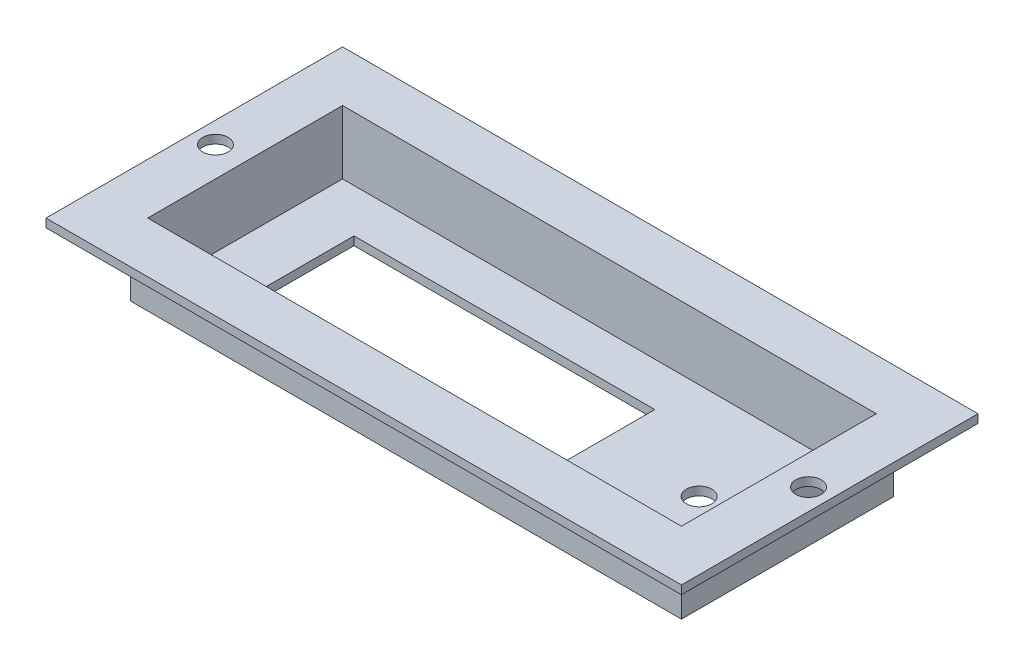
ISO-10303-21;
HEADER;
FILE_DESCRIPTION(('STEP AP214'),'2;1');
FILE_NAME('part.step','',(''),(''),'','','');
FILE_SCHEMA(('AUTOMOTIVE_DESIGN { 1 0 10303 214 1 1 1 1 }'));
ENDSEC;
DATA;
#1=APPLICATION_CONTEXT('core data for automotive mechanical design processes');
#2=APPLICATION_PROTOCOL_DEFINITION('international standard','automotive_design',2000,#1);
#3=PRODUCT_CONTEXT('',#1,'mechanical');
#4=PRODUCT('Part','Part','',(#3));
#5=PRODUCT_RELATED_PRODUCT_CATEGORY('part','',(#4));
#6=PRODUCT_DEFINITION_FORMATION('','',#4);
#7=PRODUCT_DEFINITION_CONTEXT('part definition',#1,'design');
#8=PRODUCT_DEFINITION('design','',#6,#7);
#9=PRODUCT_DEFINITION_SHAPE('','',#8);
#10=(LENGTH_UNIT() NAMED_UNIT(*) SI_UNIT(.MILLI.,.METRE.));
#11=(NAMED_UNIT(*) PLANE_ANGLE_UNIT() SI_UNIT($,.RADIAN.));
#12=(NAMED_UNIT(*) SI_UNIT($,.STERADIAN.) SOLID_ANGLE_UNIT());
#13=UNCERTAINTY_MEASURE_WITH_UNIT(LENGTH_MEASURE(1.E-05),#10,'distance_accuracy_value','');
#14=(GEOMETRIC_REPRESENTATION_CONTEXT(3) GLOBAL_UNCERTAINTY_ASSIGNED_CONTEXT((#13)) GLOBAL_UNIT_ASSIGNED_CONTEXT((#10,
#11,#12)) REPRESENTATION_CONTEXT('',''));
#15=CARTESIAN_POINT('',(0.,0.,0.));
#16=DIRECTION('',(0.,0.,1.));
#17=DIRECTION('',(1.,0.,0.));
#18=AXIS2_PLACEMENT_3D('',#15,#16,#17);
#19=CARTESIAN_POINT('',(-75.,15.,35.));
#20=DIRECTION('',(-1.,0.,0.));
#21=DIRECTION('',(0.,0.,1.));
#22=AXIS2_PLACEMENT_3D('',#19,#20,#21);
#23=PLANE('',#22);
#24=DIRECTION('',(0.,1.,0.));
#25=VECTOR('',#24,1.);
#26=CARTESIAN_POINT('',(-75.,15.,35.));
#27=LINE('',#26,#25);
#28=CARTESIAN_POINT('',(-75.,15.,35.));
#29=VERTEX_POINT('',#28);
#30=CARTESIAN_POINT('',(-75.,17.,35.));
#31=VERTEX_POINT('',#30);
#32=EDGE_CURVE('E234',#29,#31,#27,.T.);
#33=ORIENTED_EDGE('',*,*,#32,.T.);
#34=DIRECTION('',(0.,0.,1.));
#35=VECTOR('',#34,1.);
#36=CARTESIAN_POINT('',(-75.,17.,35.));
#37=LINE('',#36,#35);
#38=CARTESIAN_POINT('',(-75.,17.,-35.));
#39=VERTEX_POINT('',#38);
#40=EDGE_CURVE('E56',#39,#31,#37,.T.);
#41=ORIENTED_EDGE('',*,*,#40,.F.);
#42=DIRECTION('',(0.,1.,0.));
#43=VECTOR('',#42,1.);
#44=CARTESIAN_POINT('',(-75.,15.,-35.));
#45=LINE('',#44,#43);
#46=CARTESIAN_POINT('',(-75.,15.,-35.));
#47=VERTEX_POINT('',#46);
#48=EDGE_CURVE('E235',#47,#39,#45,.T.);
#49=ORIENTED_EDGE('',*,*,#48,.F.);
#50=DIRECTION('',(0.,0.,1.));
#51=VECTOR('',#50,1.);
#52=CARTESIAN_POINT('',(-75.,15.,35.));
#53=LINE('',#52,#51);
#54=EDGE_CURVE('E217',#47,#29,#53,.T.);
#55=ORIENTED_EDGE('',*,*,#54,.T.);
#56=EDGE_LOOP('',(#33,#41,#49,#55));
#57=FACE_BOUND('',#56,.T.);
#58=ADVANCED_FACE('F33',(#57),#23,.T.);
#59=CARTESIAN_POINT('',(75.,15.,-35.));
#60=DIRECTION('',(0.,0.,-1.));
#61=DIRECTION('',(-1.,0.,0.));
#62=AXIS2_PLACEMENT_3D('',#59,#60,#61);
#63=PLANE('',#62);
#64=ORIENTED_EDGE('',*,*,#48,.T.);
#65=DIRECTION('',(-1.,0.,0.));
#66=VECTOR('',#65,1.);
#67=CARTESIAN_POINT('',(75.,17.,-35.));
#68=LINE('',#67,#66);
#69=CARTESIAN_POINT('',(75.,17.,-35.));
#70=VERTEX_POINT('',#69);
#71=EDGE_CURVE('E375',#70,#39,#68,.T.);
#72=ORIENTED_EDGE('',*,*,#71,.F.);
#73=DIRECTION('',(0.,1.,0.));
#74=VECTOR('',#73,1.);
#75=CARTESIAN_POINT('',(75.,15.,-35.));
#76=LINE('',#75,#74);
#77=CARTESIAN_POINT('',(75.,15.,-35.));
#78=VERTEX_POINT('',#77);
#79=EDGE_CURVE('E239',#78,#70,#76,.T.);
#80=ORIENTED_EDGE('',*,*,#79,.F.);
#81=DIRECTION('',(-1.,0.,0.));
#82=VECTOR('',#81,1.);
#83=CARTESIAN_POINT('',(75.,15.,-35.));
#84=LINE('',#83,#82);
#85=EDGE_CURVE('E231',#78,#47,#84,.T.);
#86=ORIENTED_EDGE('',*,*,#85,.T.);
#87=EDGE_LOOP('',(#64,#72,#80,#86));
#88=FACE_BOUND('',#87,.T.);
#89=ADVANCED_FACE('F312',(#88),#63,.T.);
#90=CARTESIAN_POINT('',(75.,15.,35.));
#91=DIRECTION('',(1.,0.,0.));
#92=DIRECTION('',(0.,0.,-1.));
#93=AXIS2_PLACEMENT_3D('',#90,#91,#92);
#94=PLANE('',#93);
#95=ORIENTED_EDGE('',*,*,#79,.T.);
#96=DIRECTION('',(0.,0.,-1.));
#97=VECTOR('',#96,1.);
#98=CARTESIAN_POINT('',(75.,17.,35.));
#99=LINE('',#98,#97);
#100=CARTESIAN_POINT('',(75.,17.,35.));
#101=VERTEX_POINT('',#100);
#102=EDGE_CURVE('E376',#101,#70,#99,.T.);
#103=ORIENTED_EDGE('',*,*,#102,.F.);
#104=DIRECTION('',(0.,1.,0.));
#105=VECTOR('',#104,1.);
#106=CARTESIAN_POINT('',(75.,15.,35.));
#107=LINE('',#106,#105);
#108=CARTESIAN_POINT('',(75.,15.,35.));
#109=VERTEX_POINT('',#108);
#110=EDGE_CURVE('E242',#109,#101,#107,.T.);
#111=ORIENTED_EDGE('',*,*,#110,.F.);
#112=DIRECTION('',(0.,0.,-1.));
#113=VECTOR('',#112,1.);
#114=CARTESIAN_POINT('',(75.,15.,35.));
#115=LINE('',#114,#113);
#116=EDGE_CURVE('E228',#109,#78,#115,.T.);
#117=ORIENTED_EDGE('',*,*,#116,.T.);
#118=EDGE_LOOP('',(#95,#103,#111,#117));
#119=FACE_BOUND('',#118,.T.);
#120=ADVANCED_FACE('F318',(#119),#94,.T.);
#121=CARTESIAN_POINT('',(75.,15.,35.));
#122=DIRECTION('',(0.,0.,1.));
#123=DIRECTION('',(1.,0.,0.));
#124=AXIS2_PLACEMENT_3D('',#121,#122,#123);
#125=PLANE('',#124);
#126=ORIENTED_EDGE('',*,*,#110,.T.);
#127=DIRECTION('',(1.,0.,0.));
#128=VECTOR('',#127,1.);
#129=CARTESIAN_POINT('',(75.,17.,35.));
#130=LINE('',#129,#128);
#131=EDGE_CURVE('E380',#31,#101,#130,.T.);
#132=ORIENTED_EDGE('',*,*,#131,.F.);
#133=ORIENTED_EDGE('',*,*,#32,.F.);
#134=DIRECTION('',(1.,0.,0.));
#135=VECTOR('',#134,1.);
#136=CARTESIAN_POINT('',(75.,15.,35.));
#137=LINE('',#136,#135);
#138=EDGE_CURVE('E225',#29,#109,#137,.T.);
#139=ORIENTED_EDGE('',*,*,#138,.T.);
#140=EDGE_LOOP('',(#126,#132,#133,#139));
#141=FACE_BOUND('',#140,.T.);
#142=ADVANCED_FACE('F323',(#141),#125,.T.);
#143=CARTESIAN_POINT('',(65.,30.,25.));
#144=DIRECTION('',(-1.,0.,0.));
#145=DIRECTION('',(0.,0.,1.));
#146=AXIS2_PLACEMENT_3D('',#143,#144,#145);
#147=PLANE('',#146);
#148=DIRECTION('',(0.,0.,-1.));
#149=VECTOR('',#148,1.);
#150=CARTESIAN_POINT('',(65.,15.,25.));
#151=LINE('',#150,#149);
#152=CARTESIAN_POINT('',(65.,15.,25.));
#153=VERTEX_POINT('',#152);
#154=CARTESIAN_POINT('',(65.,15.,-25.));
#155=VERTEX_POINT('',#154);
#156=EDGE_CURVE('E219',#153,#155,#151,.T.);
#157=ORIENTED_EDGE('',*,*,#156,.F.);
#158=DIRECTION('',(0.,-1.,0.));
#159=VECTOR('',#158,1.);
#160=CARTESIAN_POINT('',(65.,30.,25.));
#161=LINE('',#160,#159);
#162=CARTESIAN_POINT('',(65.,0.,25.));
#163=VERTEX_POINT('',#162);
#164=EDGE_CURVE('E187',#153,#163,#161,.T.);
#165=ORIENTED_EDGE('',*,*,#164,.T.);
#166=DIRECTION('',(0.,0.,-1.));
#167=VECTOR('',#166,1.);
#168=CARTESIAN_POINT('',(65.,0.,25.));
#169=LINE('',#168,#167);
#170=CARTESIAN_POINT('',(65.,0.,-25.));
#171=VERTEX_POINT('',#170);
#172=EDGE_CURVE('E175',#163,#171,#169,.T.);
#173=ORIENTED_EDGE('',*,*,#172,.T.);
#174=DIRECTION('',(0.,-1.,0.));
#175=VECTOR('',#174,1.);
#176=CARTESIAN_POINT('',(65.,30.,-25.));
#177=LINE('',#176,#175);
#178=EDGE_CURVE('E11',#155,#171,#177,.T.);
#179=ORIENTED_EDGE('',*,*,#178,.F.);
#180=EDGE_LOOP('',(#157,#165,#173,#179));
#181=FACE_BOUND('',#180,.T.);
#182=ADVANCED_FACE('F35',(#181),#147,.F.);
#183=CARTESIAN_POINT('',(-65.,30.,-25.));
#184=DIRECTION('',(0.,0.,1.));
#185=DIRECTION('',(1.,0.,0.));
#186=AXIS2_PLACEMENT_3D('',#183,#184,#185);
#187=PLANE('',#186);
#188=DIRECTION('',(-1.,0.,0.));
#189=VECTOR('',#188,1.);
#190=CARTESIAN_POINT('',(-65.,15.,-25.));
#191=LINE('',#190,#189);
#192=CARTESIAN_POINT('',(-65.,15.,-25.));
#193=VERTEX_POINT('',#192);
#194=EDGE_CURVE('E215',#155,#193,#191,.T.);
#195=ORIENTED_EDGE('',*,*,#194,.F.);
#196=ORIENTED_EDGE('',*,*,#178,.T.);
#197=DIRECTION('',(-1.,0.,0.));
#198=VECTOR('',#197,1.);
#199=CARTESIAN_POINT('',(-65.,0.,-25.));
#200=LINE('',#199,#198);
#201=CARTESIAN_POINT('',(-65.,0.,-25.));
#202=VERTEX_POINT('',#201);
#203=EDGE_CURVE('E178',#171,#202,#200,.T.);
#204=ORIENTED_EDGE('',*,*,#203,.T.);
#205=DIRECTION('',(0.,-1.,0.));
#206=VECTOR('',#205,1.);
#207=CARTESIAN_POINT('',(-65.,30.,-25.));
#208=LINE('',#207,#206);
#209=EDGE_CURVE('E41',#193,#202,#208,.T.);
#210=ORIENTED_EDGE('',*,*,#209,.F.);
#211=EDGE_LOOP('',(#195,#196,#204,#210));
#212=FACE_BOUND('',#211,.T.);
#213=ADVANCED_FACE('F201',(#212),#187,.F.);
#214=CARTESIAN_POINT('',(-65.,30.,25.));
#215=DIRECTION('',(1.,0.,0.));
#216=DIRECTION('',(0.,0.,-1.));
#217=AXIS2_PLACEMENT_3D('',#214,#215,#216);
#218=PLANE('',#217);
#219=DIRECTION('',(0.,0.,1.));
#220=VECTOR('',#219,1.);
#221=CARTESIAN_POINT('',(-65.,15.,25.));
#222=LINE('',#221,#220);
#223=CARTESIAN_POINT('',(-65.,15.,25.));
#224=VERTEX_POINT('',#223);
#225=EDGE_CURVE('E197',#193,#224,#222,.T.);
#226=ORIENTED_EDGE('',*,*,#225,.F.);
#227=ORIENTED_EDGE('',*,*,#209,.T.);
#228=DIRECTION('',(0.,0.,1.));
#229=VECTOR('',#228,1.);
#230=CARTESIAN_POINT('',(-65.,0.,25.));
#231=LINE('',#230,#229);
#232=CARTESIAN_POINT('',(-65.,0.,25.));
#233=VERTEX_POINT('',#232);
#234=EDGE_CURVE('E181',#202,#233,#231,.T.);
#235=ORIENTED_EDGE('',*,*,#234,.T.);
#236=DIRECTION('',(0.,-1.,0.));
#237=VECTOR('',#236,1.);
#238=CARTESIAN_POINT('',(-65.,30.,25.));
#239=LINE('',#238,#237);
#240=EDGE_CURVE('E189',#224,#233,#239,.T.);
#241=ORIENTED_EDGE('',*,*,#240,.F.);
#242=EDGE_LOOP('',(#226,#227,#235,#241));
#243=FACE_BOUND('',#242,.T.);
#244=ADVANCED_FACE('F192',(#243),#218,.F.);
#245=CARTESIAN_POINT('',(-65.,30.,25.));
#246=DIRECTION('',(0.,0.,-1.));
#247=DIRECTION('',(-1.,0.,0.));
#248=AXIS2_PLACEMENT_3D('',#245,#246,#247);
#249=PLANE('',#248);
#250=DIRECTION('',(1.,0.,0.));
#251=VECTOR('',#250,1.);
#252=CARTESIAN_POINT('',(-65.,15.,25.));
#253=LINE('',#252,#251);
#254=EDGE_CURVE('E210',#224,#153,#253,.T.);
#255=ORIENTED_EDGE('',*,*,#254,.F.);
#256=ORIENTED_EDGE('',*,*,#240,.T.);
#257=DIRECTION('',(1.,0.,0.));
#258=VECTOR('',#257,1.);
#259=CARTESIAN_POINT('',(-65.,0.,25.));
#260=LINE('',#259,#258);
#261=EDGE_CURVE('E184',#233,#163,#260,.T.);
#262=ORIENTED_EDGE('',*,*,#261,.T.);
#263=ORIENTED_EDGE('',*,*,#164,.F.);
#264=EDGE_LOOP('',(#255,#256,#262,#263));
#265=FACE_BOUND('',#264,.T.);
#266=ADVANCED_FACE('F207',(#265),#249,.F.);
#267=CARTESIAN_POINT('',(0.,0.,0.));
#268=DIRECTION('',(0.,-1.,0.));
#269=DIRECTION('',(0.,0.,-1.));
#270=AXIS2_PLACEMENT_3D('',#267,#268,#269);
#271=PLANE('',#270);
#272=CARTESIAN_POINT('',(43.9980881,0.,-0.173527088836137));
#273=DIRECTION('',(0.,-1.,0.));
#274=DIRECTION('',(0.,0.,-1.));
#275=AXIS2_PLACEMENT_3D('',#272,#273,#274);
#276=CIRCLE('',#275,3.);
#277=CARTESIAN_POINT('',(43.9980881,0.,-3.17352708883614));
#278=VERTEX_POINT('',#277);
#279=EDGE_CURVE('E238',#278,#278,#276,.T.);
#280=ORIENTED_EDGE('',*,*,#279,.F.);
#281=EDGE_LOOP('',(#280));
#282=FACE_BOUND('',#281,.T.);
#283=DIRECTION('',(0.,0.,-1.));
#284=VECTOR('',#283,1.);
#285=CARTESIAN_POINT('',(-50.,0.,-12.7000610101509));
#286=LINE('',#285,#284);
#287=CARTESIAN_POINT('',(-50.,0.,11.7999389898491));
#288=VERTEX_POINT('',#287);
#289=CARTESIAN_POINT('',(-50.,0.,-12.7000610101509));
#290=VERTEX_POINT('',#289);
#291=EDGE_CURVE('E252',#288,#290,#286,.T.);
#292=ORIENTED_EDGE('',*,*,#291,.F.);
#293=DIRECTION('',(-1.,0.,0.));
#294=VECTOR('',#293,1.);
#295=CARTESIAN_POINT('',(-50.,0.,11.7999389898491));
#296=LINE('',#295,#294);
#297=CARTESIAN_POINT('',(20.9999999666218,0.,11.7999389898491));
#298=VERTEX_POINT('',#297);
#299=EDGE_CURVE('E269',#298,#288,#296,.T.);
#300=ORIENTED_EDGE('',*,*,#299,.F.);
#301=DIRECTION('',(0.,0.,1.));
#302=VECTOR('',#301,1.);
#303=CARTESIAN_POINT('',(20.9999999666218,0.,-12.7000610101509));
#304=LINE('',#303,#302);
#305=CARTESIAN_POINT('',(20.9999999666218,0.,-12.7000610101509));
#306=VERTEX_POINT('',#305);
#307=EDGE_CURVE('E266',#306,#298,#304,.T.);
#308=ORIENTED_EDGE('',*,*,#307,.F.);
#309=DIRECTION('',(1.,0.,0.));
#310=VECTOR('',#309,1.);
#311=CARTESIAN_POINT('',(-50.,0.,-12.7000610101509));
#312=LINE('',#311,#310);
#313=EDGE_CURVE('E263',#290,#306,#312,.T.);
#314=ORIENTED_EDGE('',*,*,#313,.F.);
#315=EDGE_LOOP('',(#292,#300,#308,#314));
#316=FACE_BOUND('',#315,.T.);
#317=ORIENTED_EDGE('',*,*,#172,.F.);
#318=ORIENTED_EDGE('',*,*,#261,.F.);
#319=ORIENTED_EDGE('',*,*,#234,.F.);
#320=ORIENTED_EDGE('',*,*,#203,.F.);
#321=EDGE_LOOP('',(#317,#318,#319,#320));
#322=FACE_BOUND('',#321,.T.);
#323=ADVANCED_FACE('F205',(#282,#316,#322),#271,.T.);
#324=CARTESIAN_POINT('',(63.,2.,23.));
#325=DIRECTION('',(1.,0.,0.));
#326=DIRECTION('',(0.,0.,-1.));
#327=AXIS2_PLACEMENT_3D('',#324,#325,#326);
#328=PLANE('',#327);
#329=DIRECTION('',(0.,1.,0.));
#330=VECTOR('',#329,1.);
#331=CARTESIAN_POINT('',(63.,2.,23.));
#332=LINE('',#331,#330);
#333=CARTESIAN_POINT('',(63.,2.,23.));
#334=VERTEX_POINT('',#333);
#335=CARTESIAN_POINT('',(63.,17.,23.));
#336=VERTEX_POINT('',#335);
#337=EDGE_CURVE('E157',#334,#336,#332,.T.);
#338=ORIENTED_EDGE('',*,*,#337,.T.);
#339=DIRECTION('',(0.,0.,-1.));
#340=VECTOR('',#339,1.);
#341=CARTESIAN_POINT('',(63.,17.,23.));
#342=LINE('',#341,#340);
#343=CARTESIAN_POINT('',(63.,17.,-23.));
#344=VERTEX_POINT('',#343);
#345=EDGE_CURVE('E145',#336,#344,#342,.T.);
#346=ORIENTED_EDGE('',*,*,#345,.T.);
#347=DIRECTION('',(0.,1.,0.));
#348=VECTOR('',#347,1.);
#349=CARTESIAN_POINT('',(63.,2.,-23.));
#350=LINE('',#349,#348);
#351=CARTESIAN_POINT('',(63.,2.,-23.));
#352=VERTEX_POINT('',#351);
#353=EDGE_CURVE('E155',#352,#344,#350,.T.);
#354=ORIENTED_EDGE('',*,*,#353,.F.);
#355=DIRECTION('',(0.,0.,-1.));
#356=VECTOR('',#355,1.);
#357=CARTESIAN_POINT('',(63.,2.,23.));
#358=LINE('',#357,#356);
#359=EDGE_CURVE('E281',#334,#352,#358,.T.);
#360=ORIENTED_EDGE('',*,*,#359,.F.);
#361=EDGE_LOOP('',(#338,#346,#354,#360));
#362=FACE_BOUND('',#361,.T.);
#363=ADVANCED_FACE('F153',(#362),#328,.F.);
#364=CARTESIAN_POINT('',(-63.,2.,23.));
#365=DIRECTION('',(0.,0.,1.));
#366=DIRECTION('',(1.,0.,0.));
#367=AXIS2_PLACEMENT_3D('',#364,#365,#366);
#368=PLANE('',#367);
#369=DIRECTION('',(0.,1.,0.));
#370=VECTOR('',#369,1.);
#371=CARTESIAN_POINT('',(-63.,2.,23.));
#372=LINE('',#371,#370);
#373=CARTESIAN_POINT('',(-63.,2.,23.));
#374=VERTEX_POINT('',#373);
#375=CARTESIAN_POINT('',(-63.,17.,23.));
#376=VERTEX_POINT('',#375);
#377=EDGE_CURVE('E168',#374,#376,#372,.T.);
#378=ORIENTED_EDGE('',*,*,#377,.T.);
#379=DIRECTION('',(1.,0.,0.));
#380=VECTOR('',#379,1.);
#381=CARTESIAN_POINT('',(-63.,17.,23.));
#382=LINE('',#381,#380);
#383=EDGE_CURVE('E159',#376,#336,#382,.T.);
#384=ORIENTED_EDGE('',*,*,#383,.T.);
#385=ORIENTED_EDGE('',*,*,#337,.F.);
#386=DIRECTION('',(1.,0.,0.));
#387=VECTOR('',#386,1.);
#388=CARTESIAN_POINT('',(-63.,2.,23.));
#389=LINE('',#388,#387);
#390=EDGE_CURVE('E166',#374,#334,#389,.T.);
#391=ORIENTED_EDGE('',*,*,#390,.F.);
#392=EDGE_LOOP('',(#378,#384,#385,#391));
#393=FACE_BOUND('',#392,.T.);
#394=ADVANCED_FACE('F289',(#393),#368,.F.);
#395=CARTESIAN_POINT('',(-63.,2.,23.));
#396=DIRECTION('',(-1.,0.,0.));
#397=DIRECTION('',(0.,0.,1.));
#398=AXIS2_PLACEMENT_3D('',#395,#396,#397);
#399=PLANE('',#398);
#400=DIRECTION('',(0.,1.,0.));
#401=VECTOR('',#400,1.);
#402=CARTESIAN_POINT('',(-63.,2.,-23.));
#403=LINE('',#402,#401);
#404=CARTESIAN_POINT('',(-63.,2.,-23.));
#405=VERTEX_POINT('',#404);
#406=CARTESIAN_POINT('',(-63.,17.,-23.));
#407=VERTEX_POINT('',#406);
#408=EDGE_CURVE('E165',#405,#407,#403,.T.);
#409=ORIENTED_EDGE('',*,*,#408,.T.);
#410=DIRECTION('',(0.,0.,1.));
#411=VECTOR('',#410,1.);
#412=CARTESIAN_POINT('',(-63.,17.,23.));
#413=LINE('',#412,#411);
#414=EDGE_CURVE('E48',#407,#376,#413,.T.);
#415=ORIENTED_EDGE('',*,*,#414,.T.);
#416=ORIENTED_EDGE('',*,*,#377,.F.);
#417=DIRECTION('',(0.,0.,1.));
#418=VECTOR('',#417,1.);
#419=CARTESIAN_POINT('',(-63.,2.,23.));
#420=LINE('',#419,#418);
#421=EDGE_CURVE('E171',#405,#374,#420,.T.);
#422=ORIENTED_EDGE('',*,*,#421,.F.);
#423=EDGE_LOOP('',(#409,#415,#416,#422));
#424=FACE_BOUND('',#423,.T.);
#425=ADVANCED_FACE('F292',(#424),#399,.F.);
#426=CARTESIAN_POINT('',(-63.,2.,-23.));
#427=DIRECTION('',(0.,0.,-1.));
#428=DIRECTION('',(-1.,0.,0.));
#429=AXIS2_PLACEMENT_3D('',#426,#427,#428);
#430=PLANE('',#429);
#431=ORIENTED_EDGE('',*,*,#353,.T.);
#432=DIRECTION('',(-1.,0.,0.));
#433=VECTOR('',#432,1.);
#434=CARTESIAN_POINT('',(-63.,17.,-23.));
#435=LINE('',#434,#433);
#436=EDGE_CURVE('E142',#344,#407,#435,.T.);
#437=ORIENTED_EDGE('',*,*,#436,.T.);
#438=ORIENTED_EDGE('',*,*,#408,.F.);
#439=DIRECTION('',(-1.,0.,0.));
#440=VECTOR('',#439,1.);
#441=CARTESIAN_POINT('',(-63.,2.,-23.));
#442=LINE('',#441,#440);
#443=EDGE_CURVE('E163',#352,#405,#442,.T.);
#444=ORIENTED_EDGE('',*,*,#443,.F.);
#445=EDGE_LOOP('',(#431,#437,#438,#444));
#446=FACE_BOUND('',#445,.T.);
#447=ADVANCED_FACE('F161',(#446),#430,.F.);
#448=CARTESIAN_POINT('',(0.,2.,0.));
#449=DIRECTION('',(0.,-1.,0.));
#450=DIRECTION('',(0.,0.,-1.));
#451=AXIS2_PLACEMENT_3D('',#448,#449,#450);
#452=PLANE('',#451);
#453=CARTESIAN_POINT('',(43.9980881,2.,-0.173527088836137));
#454=DIRECTION('',(0.,-1.,0.));
#455=DIRECTION('',(0.,0.,-1.));
#456=AXIS2_PLACEMENT_3D('',#453,#454,#455);
#457=CIRCLE('',#456,3.);
#458=CARTESIAN_POINT('',(43.9980881,2.,-3.17352708883614));
#459=VERTEX_POINT('',#458);
#460=EDGE_CURVE('E249',#459,#459,#457,.F.);
#461=ORIENTED_EDGE('',*,*,#460,.F.);
#462=EDGE_LOOP('',(#461));
#463=FACE_BOUND('',#462,.T.);
#464=DIRECTION('',(1.,0.,0.));
#465=VECTOR('',#464,1.);
#466=CARTESIAN_POINT('',(-50.,2.,11.7999389898491));
#467=LINE('',#466,#465);
#468=CARTESIAN_POINT('',(-50.,2.,11.7999389898491));
#469=VERTEX_POINT('',#468);
#470=CARTESIAN_POINT('',(20.9999999666218,2.,11.7999389898491));
#471=VERTEX_POINT('',#470);
#472=EDGE_CURVE('E256',#469,#471,#467,.T.);
#473=ORIENTED_EDGE('',*,*,#472,.F.);
#474=DIRECTION('',(0.,0.,1.));
#475=VECTOR('',#474,1.);
#476=CARTESIAN_POINT('',(-50.,2.,-12.7000610101509));
#477=LINE('',#476,#475);
#478=CARTESIAN_POINT('',(-50.,2.,-12.7000610101509));
#479=VERTEX_POINT('',#478);
#480=EDGE_CURVE('E259',#479,#469,#477,.T.);
#481=ORIENTED_EDGE('',*,*,#480,.F.);
#482=DIRECTION('',(-1.,0.,0.));
#483=VECTOR('',#482,1.);
#484=CARTESIAN_POINT('',(-50.,2.,-12.7000610101509));
#485=LINE('',#484,#483);
#486=CARTESIAN_POINT('',(20.9999999666218,2.,-12.7000610101509));
#487=VERTEX_POINT('',#486);
#488=EDGE_CURVE('E261',#487,#479,#485,.T.);
#489=ORIENTED_EDGE('',*,*,#488,.F.);
#490=DIRECTION('',(0.,0.,-1.));
#491=VECTOR('',#490,1.);
#492=CARTESIAN_POINT('',(20.9999999666218,2.,-12.7000610101509));
#493=LINE('',#492,#491);
#494=EDGE_CURVE('E253',#471,#487,#493,.T.);
#495=ORIENTED_EDGE('',*,*,#494,.F.);
#496=EDGE_LOOP('',(#473,#481,#489,#495));
#497=FACE_BOUND('',#496,.T.);
#498=ORIENTED_EDGE('',*,*,#359,.T.);
#499=ORIENTED_EDGE('',*,*,#443,.T.);
#500=ORIENTED_EDGE('',*,*,#421,.T.);
#501=ORIENTED_EDGE('',*,*,#390,.T.);
#502=EDGE_LOOP('',(#498,#499,#500,#501));
#503=FACE_BOUND('',#502,.T.);
#504=ADVANCED_FACE('F294',(#463,#497,#503),#452,.F.);
#505=CARTESIAN_POINT('',(-50.,77.1082551738509,-12.7000610101509));
#506=DIRECTION('',(-1.,0.,0.));
#507=DIRECTION('',(0.,0.,1.));
#508=AXIS2_PLACEMENT_3D('',#505,#506,#507);
#509=PLANE('',#508);
#510=ORIENTED_EDGE('',*,*,#480,.T.);
#511=DIRECTION('',(0.,-1.,0.));
#512=VECTOR('',#511,1.);
#513=CARTESIAN_POINT('',(-50.,77.1082551738509,11.7999389898491));
#514=LINE('',#513,#512);
#515=EDGE_CURVE('E257',#469,#288,#514,.T.);
#516=ORIENTED_EDGE('',*,*,#515,.T.);
#517=ORIENTED_EDGE('',*,*,#291,.T.);
#518=DIRECTION('',(0.,-1.,0.));
#519=VECTOR('',#518,1.);
#520=CARTESIAN_POINT('',(-50.,77.1082551738509,-12.7000610101509));
#521=LINE('',#520,#519);
#522=EDGE_CURVE('E272',#479,#290,#521,.T.);
#523=ORIENTED_EDGE('',*,*,#522,.F.);
#524=EDGE_LOOP('',(#510,#516,#517,#523));
#525=FACE_BOUND('',#524,.T.);
#526=ADVANCED_FACE('F296',(#525),#509,.F.);
#527=CARTESIAN_POINT('',(-50.,77.1082551738509,11.7999389898491));
#528=DIRECTION('',(0.,0.,1.));
#529=DIRECTION('',(1.,0.,0.));
#530=AXIS2_PLACEMENT_3D('',#527,#528,#529);
#531=PLANE('',#530);
#532=ORIENTED_EDGE('',*,*,#472,.T.);
#533=DIRECTION('',(0.,-1.,0.));
#534=VECTOR('',#533,1.);
#535=CARTESIAN_POINT('',(20.9999999666218,77.1082551738509,11.7999389898491));
#536=LINE('',#535,#534);
#537=EDGE_CURVE('E274',#471,#298,#536,.T.);
#538=ORIENTED_EDGE('',*,*,#537,.T.);
#539=ORIENTED_EDGE('',*,*,#299,.T.);
#540=ORIENTED_EDGE('',*,*,#515,.F.);
#541=EDGE_LOOP('',(#532,#538,#539,#540));
#542=FACE_BOUND('',#541,.T.);
#543=ADVANCED_FACE('F303',(#542),#531,.F.);
#544=CARTESIAN_POINT('',(20.9999999666218,77.1082551738509,-12.7000610101509));
#545=DIRECTION('',(1.,0.,0.));
#546=DIRECTION('',(0.,0.,-1.));
#547=AXIS2_PLACEMENT_3D('',#544,#545,#546);
#548=PLANE('',#547);
#549=ORIENTED_EDGE('',*,*,#494,.T.);
#550=DIRECTION('',(0.,-1.,0.));
#551=VECTOR('',#550,1.);
#552=CARTESIAN_POINT('',(20.9999999666218,77.1082551738509,-12.7000610101509));
#553=LINE('',#552,#551);
#554=EDGE_CURVE('E276',#487,#306,#553,.T.);
#555=ORIENTED_EDGE('',*,*,#554,.T.);
#556=ORIENTED_EDGE('',*,*,#307,.T.);
#557=ORIENTED_EDGE('',*,*,#537,.F.);
#558=EDGE_LOOP('',(#549,#555,#556,#557));
#559=FACE_BOUND('',#558,.T.);
#560=ADVANCED_FACE('F332',(#559),#548,.F.);
#561=CARTESIAN_POINT('',(-50.,77.1082551738509,-12.7000610101509));
#562=DIRECTION('',(0.,0.,-1.));
#563=DIRECTION('',(-1.,0.,0.));
#564=AXIS2_PLACEMENT_3D('',#561,#562,#563);
#565=PLANE('',#564);
#566=ORIENTED_EDGE('',*,*,#488,.T.);
#567=ORIENTED_EDGE('',*,*,#522,.T.);
#568=ORIENTED_EDGE('',*,*,#313,.T.);
#569=ORIENTED_EDGE('',*,*,#554,.F.);
#570=EDGE_LOOP('',(#566,#567,#568,#569));
#571=FACE_BOUND('',#570,.T.);
#572=ADVANCED_FACE('F328',(#571),#565,.F.);
#573=CARTESIAN_POINT('',(43.9980881,77.1082551738509,-0.173527088836137));
#574=DIRECTION('',(0.,-1.,0.));
#575=DIRECTION('',(0.,0.,-1.));
#576=AXIS2_PLACEMENT_3D('',#573,#574,#575);
#577=CYLINDRICAL_SURFACE('',#576,3.);
#578=ORIENTED_EDGE('',*,*,#460,.T.);
#579=EDGE_LOOP('',(#578));
#580=FACE_BOUND('',#579,.T.);
#581=ORIENTED_EDGE('',*,*,#279,.T.);
#582=EDGE_LOOP('',(#581));
#583=FACE_BOUND('',#582,.T.);
#584=ADVANCED_FACE('F325',(#580,#583),#577,.F.);
#585=CARTESIAN_POINT('',(0.,15.,0.));
#586=DIRECTION('',(0.,1.,0.));
#587=DIRECTION('',(0.,0.,1.));
#588=AXIS2_PLACEMENT_3D('',#585,#586,#587);
#589=PLANE('',#588);
#590=CARTESIAN_POINT('',(70.,15.,0.));
#591=DIRECTION('',(0.,1.,0.));
#592=DIRECTION('',(0.,0.,1.));
#593=AXIS2_PLACEMENT_3D('',#590,#591,#592);
#594=CIRCLE('',#593,3.00000000000001);
#595=CARTESIAN_POINT('',(70.,15.,3.00000000000001));
#596=VERTEX_POINT('',#595);
#597=EDGE_CURVE('E389',#596,#596,#594,.F.);
#598=ORIENTED_EDGE('',*,*,#597,.F.);
#599=EDGE_LOOP('',(#598));
#600=FACE_BOUND('',#599,.T.);
#601=CARTESIAN_POINT('',(-70.,15.,0.));
#602=DIRECTION('',(0.,1.,0.));
#603=DIRECTION('',(0.,0.,1.));
#604=AXIS2_PLACEMENT_3D('',#601,#602,#603);
#605=CIRCLE('',#604,3.00000000000001);
#606=CARTESIAN_POINT('',(-70.,15.,3.00000000000001));
#607=VERTEX_POINT('',#606);
#608=EDGE_CURVE('E383',#607,#607,#605,.F.);
#609=ORIENTED_EDGE('',*,*,#608,.F.);
#610=EDGE_LOOP('',(#609));
#611=FACE_BOUND('',#610,.T.);
#612=ORIENTED_EDGE('',*,*,#254,.T.);
#613=ORIENTED_EDGE('',*,*,#156,.T.);
#614=ORIENTED_EDGE('',*,*,#194,.T.);
#615=ORIENTED_EDGE('',*,*,#225,.T.);
#616=EDGE_LOOP('',(#612,#613,#614,#615));
#617=FACE_BOUND('',#616,.T.);
#618=ORIENTED_EDGE('',*,*,#54,.F.);
#619=ORIENTED_EDGE('',*,*,#85,.F.);
#620=ORIENTED_EDGE('',*,*,#116,.F.);
#621=ORIENTED_EDGE('',*,*,#138,.F.);
#622=EDGE_LOOP('',(#618,#619,#620,#621));
#623=FACE_BOUND('',#622,.T.);
#624=ADVANCED_FACE('F212',(#600,#611,#617,#623),#589,.F.);
#625=CARTESIAN_POINT('',(0.,17.,0.));
#626=DIRECTION('',(0.,1.,0.));
#627=DIRECTION('',(0.,0.,1.));
#628=AXIS2_PLACEMENT_3D('',#625,#626,#627);
#629=PLANE('',#628);
#630=CARTESIAN_POINT('',(70.,17.,0.));
#631=DIRECTION('',(0.,1.,0.));
#632=DIRECTION('',(0.,0.,1.));
#633=AXIS2_PLACEMENT_3D('',#630,#631,#632);
#634=CIRCLE('',#633,3.00000000000001);
#635=CARTESIAN_POINT('',(70.,17.,3.00000000000001));
#636=VERTEX_POINT('',#635);
#637=EDGE_CURVE('E158',#636,#636,#634,.T.);
#638=ORIENTED_EDGE('',*,*,#637,.F.);
#639=EDGE_LOOP('',(#638));
#640=FACE_BOUND('',#639,.T.);
#641=CARTESIAN_POINT('',(-70.,17.,0.));
#642=DIRECTION('',(0.,1.,0.));
#643=DIRECTION('',(0.,0.,1.));
#644=AXIS2_PLACEMENT_3D('',#641,#642,#643);
#645=CIRCLE('',#644,3.00000000000001);
#646=CARTESIAN_POINT('',(-70.,17.,3.00000000000001));
#647=VERTEX_POINT('',#646);
#648=EDGE_CURVE('E386',#647,#647,#645,.T.);
#649=ORIENTED_EDGE('',*,*,#648,.F.);
#650=EDGE_LOOP('',(#649));
#651=FACE_BOUND('',#650,.T.);
#652=ORIENTED_EDGE('',*,*,#40,.T.);
#653=ORIENTED_EDGE('',*,*,#131,.T.);
#654=ORIENTED_EDGE('',*,*,#102,.T.);
#655=ORIENTED_EDGE('',*,*,#71,.T.);
#656=EDGE_LOOP('',(#652,#653,#654,#655));
#657=FACE_BOUND('',#656,.T.);
#658=ORIENTED_EDGE('',*,*,#383,.F.);
#659=ORIENTED_EDGE('',*,*,#414,.F.);
#660=ORIENTED_EDGE('',*,*,#436,.F.);
#661=ORIENTED_EDGE('',*,*,#345,.F.);
#662=EDGE_LOOP('',(#658,#659,#660,#661));
#663=FACE_BOUND('',#662,.T.);
#664=ADVANCED_FACE('F144',(#640,#651,#657,#663),#629,.T.);
#665=CARTESIAN_POINT('',(-70.,6.51471862576141,0.));
#666=DIRECTION('',(0.,1.,0.));
#667=DIRECTION('',(0.,0.,1.));
#668=AXIS2_PLACEMENT_3D('',#665,#666,#667);
#669=CYLINDRICAL_SURFACE('',#668,3.00000000000001);
#670=ORIENTED_EDGE('',*,*,#608,.T.);
#671=EDGE_LOOP('',(#670));
#672=FACE_BOUND('',#671,.T.);
#673=ORIENTED_EDGE('',*,*,#648,.T.);
#674=EDGE_LOOP('',(#673));
#675=FACE_BOUND('',#674,.T.);
#676=ADVANCED_FACE('F401',(#672,#675),#669,.F.);
#677=CARTESIAN_POINT('',(70.,6.51471862576141,0.));
#678=DIRECTION('',(0.,1.,0.));
#679=DIRECTION('',(0.,0.,1.));
#680=AXIS2_PLACEMENT_3D('',#677,#678,#679);
#681=CYLINDRICAL_SURFACE('',#680,3.00000000000001);
#682=ORIENTED_EDGE('',*,*,#597,.T.);
#683=EDGE_LOOP('',(#682));
#684=FACE_BOUND('',#683,.T.);
#685=ORIENTED_EDGE('',*,*,#637,.T.);
#686=EDGE_LOOP('',(#685));
#687=FACE_BOUND('',#686,.T.);
#688=ADVANCED_FACE('F397',(#684,#687),#681,.F.);
#689=CLOSED_SHELL('',(#58,#89,#120,#142,#182,#213,#244,#266,#323,#363,#394,#425,#447,#504,#526,
#543,#560,#572,#584,#624,#664,#676,#688));
#690=MANIFOLD_SOLID_BREP('B2',#689);
#691=ADVANCED_BREP_SHAPE_REPRESENTATION('',(#18,#690),#14);
#692=SHAPE_DEFINITION_REPRESENTATION(#9,#691);
ENDSEC;
END-ISO-10303-21;
